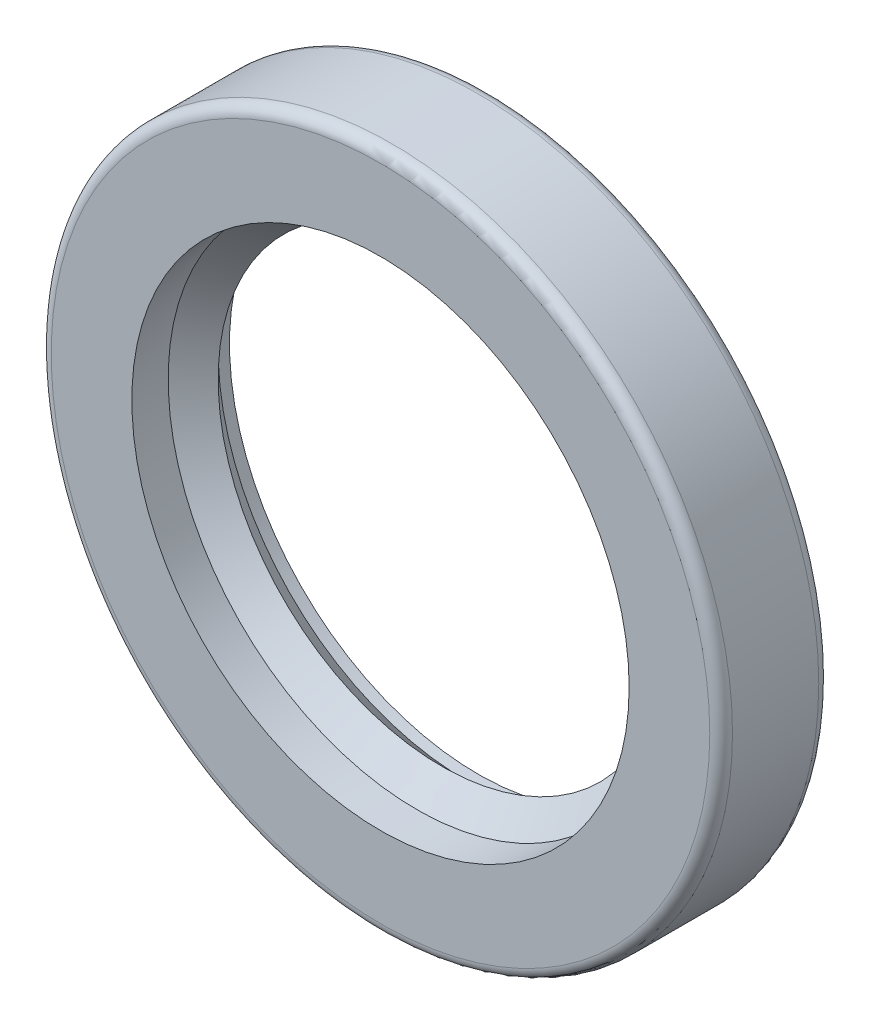
ISO-10303-21;
HEADER;
FILE_DESCRIPTION(('STEP AP214'),'2;1');
FILE_NAME('part.step','',(''),(''),'','','');
FILE_SCHEMA(('AUTOMOTIVE_DESIGN { 1 0 10303 214 1 1 1 1 }'));
ENDSEC;
DATA;
#1=APPLICATION_CONTEXT('core data for automotive mechanical design processes');
#2=APPLICATION_PROTOCOL_DEFINITION('international standard','automotive_design',2000,#1);
#3=PRODUCT_CONTEXT('',#1,'mechanical');
#4=PRODUCT('Part','Part','',(#3));
#5=PRODUCT_RELATED_PRODUCT_CATEGORY('part','',(#4));
#6=PRODUCT_DEFINITION_FORMATION('','',#4);
#7=PRODUCT_DEFINITION_CONTEXT('part definition',#1,'design');
#8=PRODUCT_DEFINITION('design','',#6,#7);
#9=PRODUCT_DEFINITION_SHAPE('','',#8);
#10=(LENGTH_UNIT() NAMED_UNIT(*) SI_UNIT(.MILLI.,.METRE.));
#11=(NAMED_UNIT(*) PLANE_ANGLE_UNIT() SI_UNIT($,.RADIAN.));
#12=(NAMED_UNIT(*) SI_UNIT($,.STERADIAN.) SOLID_ANGLE_UNIT());
#13=UNCERTAINTY_MEASURE_WITH_UNIT(LENGTH_MEASURE(1.E-05),#10,'distance_accuracy_value','');
#14=(GEOMETRIC_REPRESENTATION_CONTEXT(3) GLOBAL_UNCERTAINTY_ASSIGNED_CONTEXT((#13)) GLOBAL_UNIT_ASSIGNED_CONTEXT((#10,
#11,#12)) REPRESENTATION_CONTEXT('',''));
#15=CARTESIAN_POINT('',(0.,0.,0.));
#16=DIRECTION('',(0.,0.,1.));
#17=DIRECTION('',(1.,0.,0.));
#18=AXIS2_PLACEMENT_3D('',#15,#16,#17);
#19=CARTESIAN_POINT('',(0.,0.,-5.461));
#20=DIRECTION('',(0.,0.,1.));
#21=DIRECTION('',(1.,0.,0.));
#22=AXIS2_PLACEMENT_3D('',#19,#20,#21);
#23=TOROIDAL_SURFACE('',#22,18.415,0.635);
#24=CARTESIAN_POINT('',(0.,0.,-5.46099999999999));
#25=DIRECTION('',(0.,0.,1.));
#26=DIRECTION('',(1.,0.,0.));
#27=AXIS2_PLACEMENT_3D('',#24,#25,#26);
#28=CIRCLE('',#27,19.05);
#29=CARTESIAN_POINT('',(19.05,0.,-5.46099999999999));
#30=VERTEX_POINT('',#29);
#31=EDGE_CURVE('E77',#30,#30,#28,.T.);
#32=ORIENTED_EDGE('',*,*,#31,.F.);
#33=EDGE_LOOP('',(#32));
#34=FACE_BOUND('',#33,.T.);
#35=CARTESIAN_POINT('',(0.,0.,-6.096));
#36=DIRECTION('',(0.,0.,1.));
#37=DIRECTION('',(1.,0.,0.));
#38=AXIS2_PLACEMENT_3D('',#35,#36,#37);
#39=CIRCLE('',#38,18.415);
#40=CARTESIAN_POINT('',(18.415,0.,-6.096));
#41=VERTEX_POINT('',#40);
#42=EDGE_CURVE('E10',#41,#41,#39,.T.);
#43=ORIENTED_EDGE('',*,*,#42,.T.);
#44=EDGE_LOOP('',(#43));
#45=FACE_BOUND('',#44,.T.);
#46=ADVANCED_FACE('F28',(#34,#45),#23,.T.);
#47=CARTESIAN_POINT('',(0.,18.415,-6.096));
#48=DIRECTION('',(0.,0.,1.));
#49=DIRECTION('',(1.,0.,0.));
#50=AXIS2_PLACEMENT_3D('',#47,#48,#49);
#51=PLANE('',#50);
#52=ORIENTED_EDGE('',*,*,#42,.F.);
#53=EDGE_LOOP('',(#52));
#54=FACE_BOUND('',#53,.T.);
#55=CARTESIAN_POINT('',(0.,0.,-6.096));
#56=DIRECTION('',(0.,0.,1.));
#57=DIRECTION('',(1.,0.,0.));
#58=AXIS2_PLACEMENT_3D('',#55,#56,#57);
#59=CIRCLE('',#58,17.145);
#60=CARTESIAN_POINT('',(17.145,0.,-6.096));
#61=VERTEX_POINT('',#60);
#62=EDGE_CURVE('E34',#61,#61,#59,.T.);
#63=ORIENTED_EDGE('',*,*,#62,.T.);
#64=EDGE_LOOP('',(#63));
#65=FACE_BOUND('',#64,.T.);
#66=ADVANCED_FACE('F84',(#54,#65),#51,.F.);
#67=CARTESIAN_POINT('',(0.,0.,0.));
#68=DIRECTION('',(0.,0.,1.));
#69=DIRECTION('',(1.,0.,0.));
#70=AXIS2_PLACEMENT_3D('',#67,#68,#69);
#71=CYLINDRICAL_SURFACE('',#70,17.145);
#72=ORIENTED_EDGE('',*,*,#62,.F.);
#73=EDGE_LOOP('',(#72));
#74=FACE_BOUND('',#73,.T.);
#75=CARTESIAN_POINT('',(0.,0.,-2.032));
#76=DIRECTION('',(0.,0.,1.));
#77=DIRECTION('',(1.,0.,0.));
#78=AXIS2_PLACEMENT_3D('',#75,#76,#77);
#79=CIRCLE('',#78,17.145);
#80=CARTESIAN_POINT('',(17.145,0.,-2.032));
#81=VERTEX_POINT('',#80);
#82=EDGE_CURVE('E38',#81,#81,#79,.T.);
#83=ORIENTED_EDGE('',*,*,#82,.T.);
#84=EDGE_LOOP('',(#83));
#85=FACE_BOUND('',#84,.T.);
#86=ADVANCED_FACE('F88',(#74,#85),#71,.F.);
#87=CARTESIAN_POINT('',(0.,17.145,-2.032));
#88=DIRECTION('',(0.,0.,1.));
#89=DIRECTION('',(1.,0.,0.));
#90=AXIS2_PLACEMENT_3D('',#87,#88,#89);
#91=PLANE('',#90);
#92=ORIENTED_EDGE('',*,*,#82,.F.);
#93=EDGE_LOOP('',(#92));
#94=FACE_BOUND('',#93,.T.);
#95=CARTESIAN_POINT('',(0.,0.,-2.032));
#96=DIRECTION('',(0.,0.,1.));
#97=DIRECTION('',(1.,0.,0.));
#98=AXIS2_PLACEMENT_3D('',#95,#96,#97);
#99=CIRCLE('',#98,15.24);
#100=CARTESIAN_POINT('',(15.24,0.,-2.032));
#101=VERTEX_POINT('',#100);
#102=EDGE_CURVE('E42',#101,#101,#99,.T.);
#103=ORIENTED_EDGE('',*,*,#102,.T.);
#104=EDGE_LOOP('',(#103));
#105=FACE_BOUND('',#104,.T.);
#106=ADVANCED_FACE('F93',(#94,#105),#91,.F.);
#107=CARTESIAN_POINT('',(0.,0.,0.));
#108=DIRECTION('',(0.,0.,1.));
#109=DIRECTION('',(1.,0.,0.));
#110=AXIS2_PLACEMENT_3D('',#107,#108,#109);
#111=CYLINDRICAL_SURFACE('',#110,15.24);
#112=ORIENTED_EDGE('',*,*,#102,.F.);
#113=EDGE_LOOP('',(#112));
#114=FACE_BOUND('',#113,.T.);
#115=CARTESIAN_POINT('',(0.,0.,-2.41300000000001));
#116=DIRECTION('',(0.,0.,1.));
#117=DIRECTION('',(1.,0.,0.));
#118=AXIS2_PLACEMENT_3D('',#115,#116,#117);
#119=CIRCLE('',#118,15.24);
#120=CARTESIAN_POINT('',(15.24,0.,-2.41300000000001));
#121=VERTEX_POINT('',#120);
#122=EDGE_CURVE('E47',#121,#121,#119,.T.);
#123=ORIENTED_EDGE('',*,*,#122,.T.);
#124=EDGE_LOOP('',(#123));
#125=FACE_BOUND('',#124,.T.);
#126=ADVANCED_FACE('F99',(#114,#125),#111,.T.);
#127=CARTESIAN_POINT('',(0.,0.,-3.42900000000001));
#128=DIRECTION('',(0.,0.,1.));
#129=DIRECTION('',(1.,0.,0.));
#130=AXIS2_PLACEMENT_3D('',#127,#128,#129);
#131=TOROIDAL_SURFACE('',#130,15.24,1.016);
#132=ORIENTED_EDGE('',*,*,#122,.F.);
#133=EDGE_LOOP('',(#132));
#134=FACE_BOUND('',#133,.T.);
#135=CARTESIAN_POINT('',(0.,0.,-4.44500000000001));
#136=DIRECTION('',(0.,0.,1.));
#137=DIRECTION('',(1.,0.,0.));
#138=AXIS2_PLACEMENT_3D('',#135,#136,#137);
#139=CIRCLE('',#138,15.24);
#140=CARTESIAN_POINT('',(15.24,0.,-4.44500000000001));
#141=VERTEX_POINT('',#140);
#142=EDGE_CURVE('E50',#141,#141,#139,.T.);
#143=ORIENTED_EDGE('',*,*,#142,.T.);
#144=EDGE_LOOP('',(#143));
#145=FACE_BOUND('',#144,.T.);
#146=ADVANCED_FACE('F103',(#134,#145),#131,.T.);
#147=CARTESIAN_POINT('',(0.,0.,0.));
#148=DIRECTION('',(0.,0.,1.));
#149=DIRECTION('',(1.,0.,0.));
#150=AXIS2_PLACEMENT_3D('',#147,#148,#149);
#151=CYLINDRICAL_SURFACE('',#150,15.24);
#152=ORIENTED_EDGE('',*,*,#142,.F.);
#153=EDGE_LOOP('',(#152));
#154=FACE_BOUND('',#153,.T.);
#155=CARTESIAN_POINT('',(0.,0.,-5.461));
#156=DIRECTION('',(0.,0.,1.));
#157=DIRECTION('',(1.,0.,0.));
#158=AXIS2_PLACEMENT_3D('',#155,#156,#157);
#159=CIRCLE('',#158,15.24);
#160=CARTESIAN_POINT('',(15.24,0.,-5.461));
#161=VERTEX_POINT('',#160);
#162=EDGE_CURVE('E53',#161,#161,#159,.T.);
#163=ORIENTED_EDGE('',*,*,#162,.T.);
#164=EDGE_LOOP('',(#163));
#165=FACE_BOUND('',#164,.T.);
#166=ADVANCED_FACE('F107',(#154,#165),#151,.T.);
#167=CARTESIAN_POINT('',(0.,15.24,-5.461));
#168=DIRECTION('',(0.,0.,1.));
#169=DIRECTION('',(1.,0.,0.));
#170=AXIS2_PLACEMENT_3D('',#167,#168,#169);
#171=PLANE('',#170);
#172=ORIENTED_EDGE('',*,*,#162,.F.);
#173=EDGE_LOOP('',(#172));
#174=FACE_BOUND('',#173,.T.);
#175=CARTESIAN_POINT('',(0.,0.,-5.461));
#176=DIRECTION('',(0.,0.,1.));
#177=DIRECTION('',(1.,0.,0.));
#178=AXIS2_PLACEMENT_3D('',#175,#176,#177);
#179=CIRCLE('',#178,13.9065);
#180=CARTESIAN_POINT('',(13.9065,0.,-5.461));
#181=VERTEX_POINT('',#180);
#182=EDGE_CURVE('E56',#181,#181,#179,.T.);
#183=ORIENTED_EDGE('',*,*,#182,.T.);
#184=EDGE_LOOP('',(#183));
#185=FACE_BOUND('',#184,.T.);
#186=ADVANCED_FACE('F111',(#174,#185),#171,.F.);
#187=CARTESIAN_POINT('',(0.,0.,0.));
#188=DIRECTION('',(0.,0.,1.));
#189=DIRECTION('',(1.,0.,0.));
#190=AXIS2_PLACEMENT_3D('',#187,#188,#189);
#191=CYLINDRICAL_SURFACE('',#190,13.9065);
#192=ORIENTED_EDGE('',*,*,#182,.F.);
#193=EDGE_LOOP('',(#192));
#194=FACE_BOUND('',#193,.T.);
#195=CARTESIAN_POINT('',(0.,0.,-4.82600000000001));
#196=DIRECTION('',(0.,0.,1.));
#197=DIRECTION('',(1.,0.,0.));
#198=AXIS2_PLACEMENT_3D('',#195,#196,#197);
#199=CIRCLE('',#198,13.9065);
#200=CARTESIAN_POINT('',(13.9065,0.,-4.82600000000001));
#201=VERTEX_POINT('',#200);
#202=EDGE_CURVE('E59',#201,#201,#199,.T.);
#203=ORIENTED_EDGE('',*,*,#202,.T.);
#204=EDGE_LOOP('',(#203));
#205=FACE_BOUND('',#204,.T.);
#206=ADVANCED_FACE('F115',(#194,#205),#191,.F.);
#207=CARTESIAN_POINT('',(0.,0.,-3.42900000000001));
#208=DIRECTION('',(0.,0.,-1.));
#209=DIRECTION('',(-1.,0.,0.));
#210=AXIS2_PLACEMENT_3D('',#207,#208,#209);
#211=CONICAL_SURFACE('',#210,12.5095,0.785398163397451);
#212=ORIENTED_EDGE('',*,*,#202,.F.);
#213=EDGE_LOOP('',(#212));
#214=FACE_BOUND('',#213,.T.);
#215=CARTESIAN_POINT('',(0.,0.,-3.42900000000001));
#216=DIRECTION('',(0.,0.,1.));
#217=DIRECTION('',(1.,0.,0.));
#218=AXIS2_PLACEMENT_3D('',#215,#216,#217);
#219=CIRCLE('',#218,12.5095);
#220=CARTESIAN_POINT('',(12.5095,0.,-3.42900000000001));
#221=VERTEX_POINT('',#220);
#222=EDGE_CURVE('E62',#221,#221,#219,.T.);
#223=ORIENTED_EDGE('',*,*,#222,.T.);
#224=EDGE_LOOP('',(#223));
#225=FACE_BOUND('',#224,.T.);
#226=ADVANCED_FACE('F119',(#214,#225),#211,.F.);
#227=CARTESIAN_POINT('',(0.,0.,-2.032));
#228=DIRECTION('',(0.,0.,1.));
#229=DIRECTION('',(1.,0.,0.));
#230=AXIS2_PLACEMENT_3D('',#227,#228,#229);
#231=CONICAL_SURFACE('',#230,13.9065,0.785398163397446);
#232=ORIENTED_EDGE('',*,*,#222,.F.);
#233=EDGE_LOOP('',(#232));
#234=FACE_BOUND('',#233,.T.);
#235=CARTESIAN_POINT('',(0.,0.,-2.032));
#236=DIRECTION('',(0.,0.,1.));
#237=DIRECTION('',(1.,0.,0.));
#238=AXIS2_PLACEMENT_3D('',#235,#236,#237);
#239=CIRCLE('',#238,13.9065);
#240=CARTESIAN_POINT('',(13.9065,0.,-2.032));
#241=VERTEX_POINT('',#240);
#242=EDGE_CURVE('E65',#241,#241,#239,.T.);
#243=ORIENTED_EDGE('',*,*,#242,.T.);
#244=EDGE_LOOP('',(#243));
#245=FACE_BOUND('',#244,.T.);
#246=ADVANCED_FACE('F123',(#234,#245),#231,.F.);
#247=CARTESIAN_POINT('',(0.,0.,0.));
#248=DIRECTION('',(0.,0.,1.));
#249=DIRECTION('',(1.,0.,0.));
#250=AXIS2_PLACEMENT_3D('',#247,#248,#249);
#251=CYLINDRICAL_SURFACE('',#250,13.9065);
#252=ORIENTED_EDGE('',*,*,#242,.F.);
#253=EDGE_LOOP('',(#252));
#254=FACE_BOUND('',#253,.T.);
#255=CARTESIAN_POINT('',(0.,0.,0.));
#256=DIRECTION('',(0.,0.,1.));
#257=DIRECTION('',(1.,0.,0.));
#258=AXIS2_PLACEMENT_3D('',#255,#256,#257);
#259=CIRCLE('',#258,13.9065);
#260=CARTESIAN_POINT('',(13.9065,0.,0.));
#261=VERTEX_POINT('',#260);
#262=EDGE_CURVE('E68',#261,#261,#259,.T.);
#263=ORIENTED_EDGE('',*,*,#262,.T.);
#264=EDGE_LOOP('',(#263));
#265=FACE_BOUND('',#264,.T.);
#266=ADVANCED_FACE('F127',(#254,#265),#251,.F.);
#267=CARTESIAN_POINT('',(0.,13.9065,0.));
#268=DIRECTION('',(0.,0.,-1.));
#269=DIRECTION('',(-1.,0.,0.));
#270=AXIS2_PLACEMENT_3D('',#267,#268,#269);
#271=PLANE('',#270);
#272=ORIENTED_EDGE('',*,*,#262,.F.);
#273=EDGE_LOOP('',(#272));
#274=FACE_BOUND('',#273,.T.);
#275=CARTESIAN_POINT('',(0.,0.,0.));
#276=DIRECTION('',(0.,0.,1.));
#277=DIRECTION('',(1.,0.,0.));
#278=AXIS2_PLACEMENT_3D('',#275,#276,#277);
#279=CIRCLE('',#278,18.415);
#280=CARTESIAN_POINT('',(18.415,0.,0.));
#281=VERTEX_POINT('',#280);
#282=EDGE_CURVE('E71',#281,#281,#279,.T.);
#283=ORIENTED_EDGE('',*,*,#282,.T.);
#284=EDGE_LOOP('',(#283));
#285=FACE_BOUND('',#284,.T.);
#286=ADVANCED_FACE('F131',(#274,#285),#271,.F.);
#287=CARTESIAN_POINT('',(0.,0.,-0.635));
#288=DIRECTION('',(0.,0.,1.));
#289=DIRECTION('',(1.,0.,0.));
#290=AXIS2_PLACEMENT_3D('',#287,#288,#289);
#291=TOROIDAL_SURFACE('',#290,18.415,0.635);
#292=ORIENTED_EDGE('',*,*,#282,.F.);
#293=EDGE_LOOP('',(#292));
#294=FACE_BOUND('',#293,.T.);
#295=CARTESIAN_POINT('',(0.,0.,-0.635000000000005));
#296=DIRECTION('',(0.,0.,1.));
#297=DIRECTION('',(1.,0.,0.));
#298=AXIS2_PLACEMENT_3D('',#295,#296,#297);
#299=CIRCLE('',#298,19.05);
#300=CARTESIAN_POINT('',(19.05,0.,-0.635000000000005));
#301=VERTEX_POINT('',#300);
#302=EDGE_CURVE('E74',#301,#301,#299,.T.);
#303=ORIENTED_EDGE('',*,*,#302,.T.);
#304=EDGE_LOOP('',(#303));
#305=FACE_BOUND('',#304,.T.);
#306=ADVANCED_FACE('F135',(#294,#305),#291,.T.);
#307=CARTESIAN_POINT('',(0.,0.,0.));
#308=DIRECTION('',(0.,0.,1.));
#309=DIRECTION('',(1.,0.,0.));
#310=AXIS2_PLACEMENT_3D('',#307,#308,#309);
#311=CYLINDRICAL_SURFACE('',#310,19.05);
#312=ORIENTED_EDGE('',*,*,#302,.F.);
#313=EDGE_LOOP('',(#312));
#314=FACE_BOUND('',#313,.T.);
#315=ORIENTED_EDGE('',*,*,#31,.T.);
#316=EDGE_LOOP('',(#315));
#317=FACE_BOUND('',#316,.T.);
#318=ADVANCED_FACE('F81',(#314,#317),#311,.T.);
#319=CLOSED_SHELL('',(#46,#66,#86,#106,#126,#146,#166,#186,#206,#226,#246,#266,#286,#306,#318));
#320=MANIFOLD_SOLID_BREP('B2',#319);
#321=ADVANCED_BREP_SHAPE_REPRESENTATION('',(#18,#320),#14);
#322=SHAPE_DEFINITION_REPRESENTATION(#9,#321);
ENDSEC;
END-ISO-10303-21;
